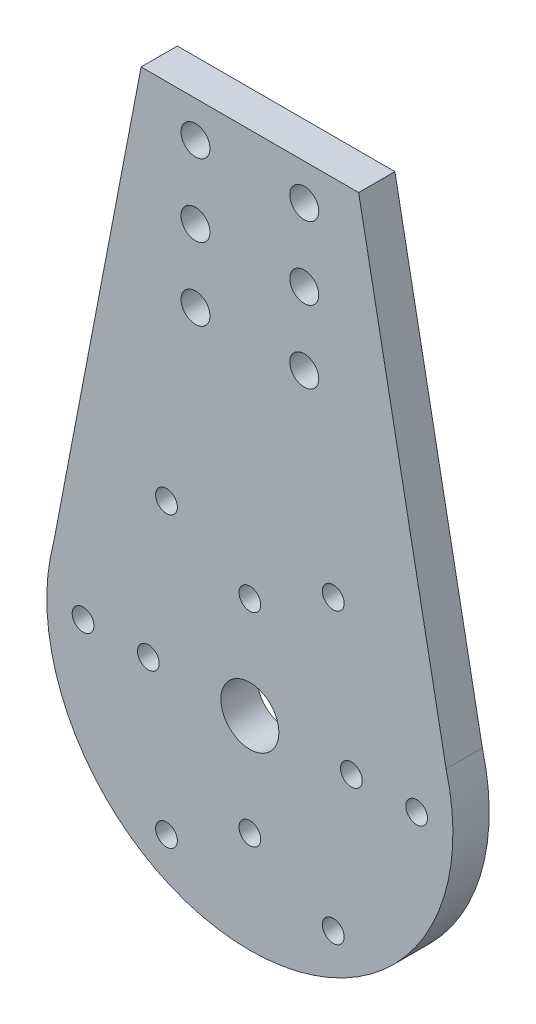
ISO-10303-21;
HEADER;
FILE_DESCRIPTION(('STEP AP214'),'2;1');
FILE_NAME('part.step','',(''),(''),'','','');
FILE_SCHEMA(('AUTOMOTIVE_DESIGN { 1 0 10303 214 1 1 1 1 }'));
ENDSEC;
DATA;
#1=APPLICATION_CONTEXT('core data for automotive mechanical design processes');
#2=APPLICATION_PROTOCOL_DEFINITION('international standard','automotive_design',2000,#1);
#3=PRODUCT_CONTEXT('',#1,'mechanical');
#4=PRODUCT('Part','Part','',(#3));
#5=PRODUCT_RELATED_PRODUCT_CATEGORY('part','',(#4));
#6=PRODUCT_DEFINITION_FORMATION('','',#4);
#7=PRODUCT_DEFINITION_CONTEXT('part definition',#1,'design');
#8=PRODUCT_DEFINITION('design','',#6,#7);
#9=PRODUCT_DEFINITION_SHAPE('','',#8);
#10=(LENGTH_UNIT() NAMED_UNIT(*) SI_UNIT(.MILLI.,.METRE.));
#11=(NAMED_UNIT(*) PLANE_ANGLE_UNIT() SI_UNIT($,.RADIAN.));
#12=(NAMED_UNIT(*) SI_UNIT($,.STERADIAN.) SOLID_ANGLE_UNIT());
#13=UNCERTAINTY_MEASURE_WITH_UNIT(LENGTH_MEASURE(1.E-05),#10,'distance_accuracy_value','');
#14=(GEOMETRIC_REPRESENTATION_CONTEXT(3) GLOBAL_UNCERTAINTY_ASSIGNED_CONTEXT((#13)) GLOBAL_UNIT_ASSIGNED_CONTEXT((#10,
#11,#12)) REPRESENTATION_CONTEXT('',''));
#15=CARTESIAN_POINT('',(0.,0.,0.));
#16=DIRECTION('',(0.,0.,1.));
#17=DIRECTION('',(1.,0.,0.));
#18=AXIS2_PLACEMENT_3D('',#15,#16,#17);
#19=CARTESIAN_POINT('',(0.,0.,5.));
#20=DIRECTION('',(0.,0.,-1.));
#21=DIRECTION('',(-1.,0.,0.));
#22=AXIS2_PLACEMENT_3D('',#19,#20,#21);
#23=CYLINDRICAL_SURFACE('',#22,28.);
#24=CARTESIAN_POINT('',(0.,0.,0.));
#25=DIRECTION('',(0.,0.,1.));
#26=DIRECTION('',(1.,0.,0.));
#27=AXIS2_PLACEMENT_3D('',#24,#25,#26);
#28=CIRCLE('',#27,28.);
#29=CARTESIAN_POINT('',(-27.0621638066991,7.1860482950914,0.));
#30=VERTEX_POINT('',#29);
#31=CARTESIAN_POINT('',(27.0621638066991,7.1860482950914,0.));
#32=VERTEX_POINT('',#31);
#33=EDGE_CURVE('E152',#30,#32,#28,.T.);
#34=ORIENTED_EDGE('',*,*,#33,.T.);
#35=DIRECTION('',(0.,0.,-1.));
#36=VECTOR('',#35,1.);
#37=CARTESIAN_POINT('',(27.0621638066991,7.1860482950914,5.));
#38=LINE('',#37,#36);
#39=CARTESIAN_POINT('',(27.0621638066991,7.1860482950914,5.));
#40=VERTEX_POINT('',#39);
#41=EDGE_CURVE('E11',#40,#32,#38,.T.);
#42=ORIENTED_EDGE('',*,*,#41,.F.);
#43=CARTESIAN_POINT('',(0.,0.,5.));
#44=DIRECTION('',(0.,0.,1.));
#45=DIRECTION('',(1.,0.,0.));
#46=AXIS2_PLACEMENT_3D('',#43,#44,#45);
#47=CIRCLE('',#46,28.);
#48=CARTESIAN_POINT('',(-27.0621638066991,7.1860482950914,5.));
#49=VERTEX_POINT('',#48);
#50=EDGE_CURVE('E77',#49,#40,#47,.T.);
#51=ORIENTED_EDGE('',*,*,#50,.F.);
#52=DIRECTION('',(0.,0.,-1.));
#53=VECTOR('',#52,1.);
#54=CARTESIAN_POINT('',(-27.0621638066991,7.1860482950914,5.));
#55=LINE('',#54,#53);
#56=EDGE_CURVE('E118',#49,#30,#55,.T.);
#57=ORIENTED_EDGE('',*,*,#56,.T.);
#58=EDGE_LOOP('',(#34,#42,#51,#57));
#59=FACE_BOUND('',#58,.T.);
#60=ADVANCED_FACE('F37',(#59),#23,.T.);
#61=CARTESIAN_POINT('',(27.4305835679166,5.26749525111794,5.));
#62=DIRECTION('',(0.982056983686742,0.188584412908647,0.));
#63=DIRECTION('',(-0.188584412908647,0.982056983686742,0.));
#64=AXIS2_PLACEMENT_3D('',#61,#62,#63);
#65=PLANE('',#64);
#66=DIRECTION('',(0.188584412908647,-0.982056983686742,0.));
#67=VECTOR('',#66,1.);
#68=CARTESIAN_POINT('',(27.4305835679166,5.26749525111794,0.));
#69=LINE('',#68,#67);
#70=CARTESIAN_POINT('',(15.,70.,0.));
#71=VERTEX_POINT('',#70);
#72=EDGE_CURVE('E86',#71,#32,#69,.T.);
#73=ORIENTED_EDGE('',*,*,#72,.F.);
#74=DIRECTION('',(0.,0.,-1.));
#75=VECTOR('',#74,1.);
#76=CARTESIAN_POINT('',(15.,70.,5.));
#77=LINE('',#76,#75);
#78=CARTESIAN_POINT('',(15.,70.,5.));
#79=VERTEX_POINT('',#78);
#80=EDGE_CURVE('E46',#79,#71,#77,.T.);
#81=ORIENTED_EDGE('',*,*,#80,.F.);
#82=DIRECTION('',(0.188584412908647,-0.982056983686742,0.));
#83=VECTOR('',#82,1.);
#84=CARTESIAN_POINT('',(27.4305835679166,5.26749525111794,5.));
#85=LINE('',#84,#83);
#86=EDGE_CURVE('E84',#79,#40,#85,.T.);
#87=ORIENTED_EDGE('',*,*,#86,.T.);
#88=ORIENTED_EDGE('',*,*,#41,.T.);
#89=EDGE_LOOP('',(#73,#81,#87,#88));
#90=FACE_BOUND('',#89,.T.);
#91=ADVANCED_FACE('F83',(#90),#65,.T.);
#92=CARTESIAN_POINT('',(0.,70.,5.));
#93=DIRECTION('',(0.,1.,0.));
#94=DIRECTION('',(0.,0.,1.));
#95=AXIS2_PLACEMENT_3D('',#92,#93,#94);
#96=PLANE('',#95);
#97=DIRECTION('',(1.,0.,0.));
#98=VECTOR('',#97,1.);
#99=CARTESIAN_POINT('',(0.,70.,0.));
#100=LINE('',#99,#98);
#101=CARTESIAN_POINT('',(-15.,70.,0.));
#102=VERTEX_POINT('',#101);
#103=EDGE_CURVE('E156',#102,#71,#100,.T.);
#104=ORIENTED_EDGE('',*,*,#103,.F.);
#105=DIRECTION('',(0.,0.,-1.));
#106=VECTOR('',#105,1.);
#107=CARTESIAN_POINT('',(-15.,70.,5.));
#108=LINE('',#107,#106);
#109=CARTESIAN_POINT('',(-15.,70.,5.));
#110=VERTEX_POINT('',#109);
#111=EDGE_CURVE('E69',#110,#102,#108,.T.);
#112=ORIENTED_EDGE('',*,*,#111,.F.);
#113=DIRECTION('',(1.,0.,0.));
#114=VECTOR('',#113,1.);
#115=CARTESIAN_POINT('',(0.,70.,5.));
#116=LINE('',#115,#114);
#117=EDGE_CURVE('E93',#110,#79,#116,.T.);
#118=ORIENTED_EDGE('',*,*,#117,.T.);
#119=ORIENTED_EDGE('',*,*,#80,.T.);
#120=EDGE_LOOP('',(#104,#112,#118,#119));
#121=FACE_BOUND('',#120,.T.);
#122=ADVANCED_FACE('F95',(#121),#96,.T.);
#123=CARTESIAN_POINT('',(7.5,55.,5.));
#124=DIRECTION('',(0.,0.,-1.));
#125=DIRECTION('',(-1.,0.,0.));
#126=AXIS2_PLACEMENT_3D('',#123,#124,#125);
#127=CYLINDRICAL_SURFACE('',#126,2.);
#128=CARTESIAN_POINT('',(7.5,55.,5.));
#129=DIRECTION('',(0.,0.,1.));
#130=DIRECTION('',(1.,0.,0.));
#131=AXIS2_PLACEMENT_3D('',#128,#129,#130);
#132=CIRCLE('',#131,2.);
#133=CARTESIAN_POINT('',(9.5,55.,5.));
#134=VERTEX_POINT('',#133);
#135=EDGE_CURVE('E112',#134,#134,#132,.T.);
#136=ORIENTED_EDGE('',*,*,#135,.T.);
#137=EDGE_LOOP('',(#136));
#138=FACE_BOUND('',#137,.T.);
#139=CARTESIAN_POINT('',(7.5,55.,0.));
#140=DIRECTION('',(0.,0.,1.));
#141=DIRECTION('',(1.,0.,0.));
#142=AXIS2_PLACEMENT_3D('',#139,#140,#141);
#143=CIRCLE('',#142,2.);
#144=CARTESIAN_POINT('',(9.5,55.,0.));
#145=VERTEX_POINT('',#144);
#146=EDGE_CURVE('E171',#145,#145,#143,.T.);
#147=ORIENTED_EDGE('',*,*,#146,.F.);
#148=EDGE_LOOP('',(#147));
#149=FACE_BOUND('',#148,.T.);
#150=ADVANCED_FACE('F470',(#138,#149),#127,.F.);
#151=CARTESIAN_POINT('',(-7.5,65.,5.));
#152=DIRECTION('',(0.,0.,-1.));
#153=DIRECTION('',(-1.,0.,0.));
#154=AXIS2_PLACEMENT_3D('',#151,#152,#153);
#155=CYLINDRICAL_SURFACE('',#154,2.);
#156=CARTESIAN_POINT('',(-7.5,65.,5.));
#157=DIRECTION('',(0.,0.,1.));
#158=DIRECTION('',(1.,0.,0.));
#159=AXIS2_PLACEMENT_3D('',#156,#157,#158);
#160=CIRCLE('',#159,2.);
#161=CARTESIAN_POINT('',(-5.5,65.,5.));
#162=VERTEX_POINT('',#161);
#163=EDGE_CURVE('E109',#162,#162,#160,.T.);
#164=ORIENTED_EDGE('',*,*,#163,.T.);
#165=EDGE_LOOP('',(#164));
#166=FACE_BOUND('',#165,.T.);
#167=CARTESIAN_POINT('',(-7.5,65.,0.));
#168=DIRECTION('',(0.,0.,1.));
#169=DIRECTION('',(1.,0.,0.));
#170=AXIS2_PLACEMENT_3D('',#167,#168,#169);
#171=CIRCLE('',#170,2.);
#172=CARTESIAN_POINT('',(-5.5,65.,0.));
#173=VERTEX_POINT('',#172);
#174=EDGE_CURVE('E168',#173,#173,#171,.T.);
#175=ORIENTED_EDGE('',*,*,#174,.F.);
#176=EDGE_LOOP('',(#175));
#177=FACE_BOUND('',#176,.T.);
#178=ADVANCED_FACE('F461',(#166,#177),#155,.F.);
#179=CARTESIAN_POINT('',(-7.5,55.,5.));
#180=DIRECTION('',(0.,0.,-1.));
#181=DIRECTION('',(-1.,0.,0.));
#182=AXIS2_PLACEMENT_3D('',#179,#180,#181);
#183=CYLINDRICAL_SURFACE('',#182,2.);
#184=CARTESIAN_POINT('',(-7.5,55.,5.));
#185=DIRECTION('',(0.,0.,1.));
#186=DIRECTION('',(1.,0.,0.));
#187=AXIS2_PLACEMENT_3D('',#184,#185,#186);
#188=CIRCLE('',#187,2.);
#189=CARTESIAN_POINT('',(-5.5,55.,5.));
#190=VERTEX_POINT('',#189);
#191=EDGE_CURVE('E106',#190,#190,#188,.T.);
#192=ORIENTED_EDGE('',*,*,#191,.T.);
#193=EDGE_LOOP('',(#192));
#194=FACE_BOUND('',#193,.T.);
#195=CARTESIAN_POINT('',(-7.5,55.,0.));
#196=DIRECTION('',(0.,0.,1.));
#197=DIRECTION('',(1.,0.,0.));
#198=AXIS2_PLACEMENT_3D('',#195,#196,#197);
#199=CIRCLE('',#198,2.);
#200=CARTESIAN_POINT('',(-5.5,55.,0.));
#201=VERTEX_POINT('',#200);
#202=EDGE_CURVE('E165',#201,#201,#199,.T.);
#203=ORIENTED_EDGE('',*,*,#202,.F.);
#204=EDGE_LOOP('',(#203));
#205=FACE_BOUND('',#204,.T.);
#206=ADVANCED_FACE('F452',(#194,#205),#183,.F.);
#207=CARTESIAN_POINT('',(-7.5,45.,5.));
#208=DIRECTION('',(0.,0.,-1.));
#209=DIRECTION('',(-1.,0.,0.));
#210=AXIS2_PLACEMENT_3D('',#207,#208,#209);
#211=CYLINDRICAL_SURFACE('',#210,2.);
#212=CARTESIAN_POINT('',(-7.5,45.,5.));
#213=DIRECTION('',(0.,0.,1.));
#214=DIRECTION('',(1.,0.,0.));
#215=AXIS2_PLACEMENT_3D('',#212,#213,#214);
#216=CIRCLE('',#215,2.);
#217=CARTESIAN_POINT('',(-5.5,45.,5.));
#218=VERTEX_POINT('',#217);
#219=EDGE_CURVE('E103',#218,#218,#216,.T.);
#220=ORIENTED_EDGE('',*,*,#219,.T.);
#221=EDGE_LOOP('',(#220));
#222=FACE_BOUND('',#221,.T.);
#223=CARTESIAN_POINT('',(-7.5,45.,0.));
#224=DIRECTION('',(0.,0.,1.));
#225=DIRECTION('',(1.,0.,0.));
#226=AXIS2_PLACEMENT_3D('',#223,#224,#225);
#227=CIRCLE('',#226,2.);
#228=CARTESIAN_POINT('',(-5.5,45.,0.));
#229=VERTEX_POINT('',#228);
#230=EDGE_CURVE('E162',#229,#229,#227,.T.);
#231=ORIENTED_EDGE('',*,*,#230,.F.);
#232=EDGE_LOOP('',(#231));
#233=FACE_BOUND('',#232,.T.);
#234=ADVANCED_FACE('F443',(#222,#233),#211,.F.);
#235=CARTESIAN_POINT('',(7.5,45.,5.));
#236=DIRECTION('',(0.,0.,-1.));
#237=DIRECTION('',(-1.,0.,0.));
#238=AXIS2_PLACEMENT_3D('',#235,#236,#237);
#239=CYLINDRICAL_SURFACE('',#238,2.);
#240=CARTESIAN_POINT('',(7.5,45.,5.));
#241=DIRECTION('',(0.,0.,1.));
#242=DIRECTION('',(1.,0.,0.));
#243=AXIS2_PLACEMENT_3D('',#240,#241,#242);
#244=CIRCLE('',#243,2.);
#245=CARTESIAN_POINT('',(9.5,45.,5.));
#246=VERTEX_POINT('',#245);
#247=EDGE_CURVE('E97',#246,#246,#244,.T.);
#248=ORIENTED_EDGE('',*,*,#247,.T.);
#249=EDGE_LOOP('',(#248));
#250=FACE_BOUND('',#249,.T.);
#251=CARTESIAN_POINT('',(7.5,45.,0.));
#252=DIRECTION('',(0.,0.,1.));
#253=DIRECTION('',(1.,0.,0.));
#254=AXIS2_PLACEMENT_3D('',#251,#252,#253);
#255=CIRCLE('',#254,2.);
#256=CARTESIAN_POINT('',(9.5,45.,0.));
#257=VERTEX_POINT('',#256);
#258=EDGE_CURVE('E159',#257,#257,#255,.T.);
#259=ORIENTED_EDGE('',*,*,#258,.F.);
#260=EDGE_LOOP('',(#259));
#261=FACE_BOUND('',#260,.T.);
#262=ADVANCED_FACE('F435',(#250,#261),#239,.F.);
#263=CARTESIAN_POINT('',(-27.4305835679166,5.26749525111794,5.));
#264=DIRECTION('',(0.982056983686742,-0.188584412908647,0.));
#265=DIRECTION('',(0.188584412908647,0.982056983686742,0.));
#266=AXIS2_PLACEMENT_3D('',#263,#264,#265);
#267=PLANE('',#266);
#268=DIRECTION('',(-0.188584412908647,-0.982056983686742,0.));
#269=VECTOR('',#268,1.);
#270=CARTESIAN_POINT('',(-27.4305835679166,5.26749525111794,0.));
#271=LINE('',#270,#269);
#272=EDGE_CURVE('E72',#102,#30,#271,.T.);
#273=ORIENTED_EDGE('',*,*,#272,.T.);
#274=ORIENTED_EDGE('',*,*,#56,.F.);
#275=DIRECTION('',(-0.188584412908647,-0.982056983686742,0.));
#276=VECTOR('',#275,1.);
#277=CARTESIAN_POINT('',(-27.4305835679166,5.26749525111794,5.));
#278=LINE('',#277,#276);
#279=EDGE_CURVE('E54',#110,#49,#278,.T.);
#280=ORIENTED_EDGE('',*,*,#279,.F.);
#281=ORIENTED_EDGE('',*,*,#111,.T.);
#282=EDGE_LOOP('',(#273,#274,#280,#281));
#283=FACE_BOUND('',#282,.T.);
#284=ADVANCED_FACE('F224',(#283),#267,.F.);
#285=CARTESIAN_POINT('',(23.,0.,5.));
#286=DIRECTION('',(0.,0.,-1.));
#287=DIRECTION('',(-1.,0.,0.));
#288=AXIS2_PLACEMENT_3D('',#285,#286,#287);
#289=CYLINDRICAL_SURFACE('',#288,1.5);
#290=CARTESIAN_POINT('',(23.,0.,5.));
#291=DIRECTION('',(0.,0.,1.));
#292=DIRECTION('',(1.,0.,0.));
#293=AXIS2_PLACEMENT_3D('',#290,#291,#292);
#294=CIRCLE('',#293,1.5);
#295=CARTESIAN_POINT('',(24.5,0.,5.));
#296=VERTEX_POINT('',#295);
#297=EDGE_CURVE('E322',#296,#296,#294,.T.);
#298=ORIENTED_EDGE('',*,*,#297,.T.);
#299=EDGE_LOOP('',(#298));
#300=FACE_BOUND('',#299,.T.);
#301=CARTESIAN_POINT('',(23.,0.,0.));
#302=DIRECTION('',(0.,0.,1.));
#303=DIRECTION('',(1.,0.,0.));
#304=AXIS2_PLACEMENT_3D('',#301,#302,#303);
#305=CIRCLE('',#304,1.5);
#306=CARTESIAN_POINT('',(24.5,0.,0.));
#307=VERTEX_POINT('',#306);
#308=EDGE_CURVE('E149',#307,#307,#305,.T.);
#309=ORIENTED_EDGE('',*,*,#308,.F.);
#310=EDGE_LOOP('',(#309));
#311=FACE_BOUND('',#310,.T.);
#312=ADVANCED_FACE('F220',(#300,#311),#289,.F.);
#313=CARTESIAN_POINT('',(11.5,19.9185842870421,5.));
#314=DIRECTION('',(0.,0.,-1.));
#315=DIRECTION('',(-1.,0.,0.));
#316=AXIS2_PLACEMENT_3D('',#313,#314,#315);
#317=CYLINDRICAL_SURFACE('',#316,1.5);
#318=CARTESIAN_POINT('',(11.5,19.9185842870421,5.));
#319=DIRECTION('',(0.,0.,1.));
#320=DIRECTION('',(1.,0.,0.));
#321=AXIS2_PLACEMENT_3D('',#318,#319,#320);
#322=CIRCLE('',#321,1.5);
#323=CARTESIAN_POINT('',(13.,19.9185842870421,5.));
#324=VERTEX_POINT('',#323);
#325=EDGE_CURVE('E319',#324,#324,#322,.T.);
#326=ORIENTED_EDGE('',*,*,#325,.T.);
#327=EDGE_LOOP('',(#326));
#328=FACE_BOUND('',#327,.T.);
#329=CARTESIAN_POINT('',(11.5,19.9185842870421,0.));
#330=DIRECTION('',(0.,0.,1.));
#331=DIRECTION('',(1.,0.,0.));
#332=AXIS2_PLACEMENT_3D('',#329,#330,#331);
#333=CIRCLE('',#332,1.5);
#334=CARTESIAN_POINT('',(13.,19.9185842870421,0.));
#335=VERTEX_POINT('',#334);
#336=EDGE_CURVE('E146',#335,#335,#333,.T.);
#337=ORIENTED_EDGE('',*,*,#336,.F.);
#338=EDGE_LOOP('',(#337));
#339=FACE_BOUND('',#338,.T.);
#340=ADVANCED_FACE('F223',(#328,#339),#317,.F.);
#341=CARTESIAN_POINT('',(-11.5000000000001,19.918584287042,5.));
#342=DIRECTION('',(0.,0.,-1.));
#343=DIRECTION('',(-1.,0.,0.));
#344=AXIS2_PLACEMENT_3D('',#341,#342,#343);
#345=CYLINDRICAL_SURFACE('',#344,1.5);
#346=CARTESIAN_POINT('',(-11.5000000000001,19.918584287042,5.));
#347=DIRECTION('',(0.,0.,1.));
#348=DIRECTION('',(1.,0.,0.));
#349=AXIS2_PLACEMENT_3D('',#346,#347,#348);
#350=CIRCLE('',#349,1.5);
#351=CARTESIAN_POINT('',(-10.0000000000001,19.918584287042,5.));
#352=VERTEX_POINT('',#351);
#353=EDGE_CURVE('E316',#352,#352,#350,.T.);
#354=ORIENTED_EDGE('',*,*,#353,.T.);
#355=EDGE_LOOP('',(#354));
#356=FACE_BOUND('',#355,.T.);
#357=CARTESIAN_POINT('',(-11.5000000000001,19.918584287042,0.));
#358=DIRECTION('',(0.,0.,1.));
#359=DIRECTION('',(1.,0.,0.));
#360=AXIS2_PLACEMENT_3D('',#357,#358,#359);
#361=CIRCLE('',#360,1.5);
#362=CARTESIAN_POINT('',(-10.0000000000001,19.918584287042,0.));
#363=VERTEX_POINT('',#362);
#364=EDGE_CURVE('E143',#363,#363,#361,.T.);
#365=ORIENTED_EDGE('',*,*,#364,.F.);
#366=EDGE_LOOP('',(#365));
#367=FACE_BOUND('',#366,.T.);
#368=ADVANCED_FACE('F228',(#356,#367),#345,.F.);
#369=CARTESIAN_POINT('',(-23.,0.,5.));
#370=DIRECTION('',(0.,0.,-1.));
#371=DIRECTION('',(-1.,0.,0.));
#372=AXIS2_PLACEMENT_3D('',#369,#370,#371);
#373=CYLINDRICAL_SURFACE('',#372,1.5);
#374=CARTESIAN_POINT('',(-23.,0.,5.));
#375=DIRECTION('',(0.,0.,1.));
#376=DIRECTION('',(1.,0.,0.));
#377=AXIS2_PLACEMENT_3D('',#374,#375,#376);
#378=CIRCLE('',#377,1.5);
#379=CARTESIAN_POINT('',(-21.5,0.,5.));
#380=VERTEX_POINT('',#379);
#381=EDGE_CURVE('E313',#380,#380,#378,.T.);
#382=ORIENTED_EDGE('',*,*,#381,.T.);
#383=EDGE_LOOP('',(#382));
#384=FACE_BOUND('',#383,.T.);
#385=CARTESIAN_POINT('',(-23.,0.,0.));
#386=DIRECTION('',(0.,0.,1.));
#387=DIRECTION('',(1.,0.,0.));
#388=AXIS2_PLACEMENT_3D('',#385,#386,#387);
#389=CIRCLE('',#388,1.5);
#390=CARTESIAN_POINT('',(-21.5,0.,0.));
#391=VERTEX_POINT('',#390);
#392=EDGE_CURVE('E140',#391,#391,#389,.T.);
#393=ORIENTED_EDGE('',*,*,#392,.F.);
#394=EDGE_LOOP('',(#393));
#395=FACE_BOUND('',#394,.T.);
#396=ADVANCED_FACE('F232',(#384,#395),#373,.F.);
#397=CARTESIAN_POINT('',(-11.4999999999999,-19.9185842870421,5.));
#398=DIRECTION('',(0.,0.,-1.));
#399=DIRECTION('',(-1.,0.,0.));
#400=AXIS2_PLACEMENT_3D('',#397,#398,#399);
#401=CYLINDRICAL_SURFACE('',#400,1.5);
#402=CARTESIAN_POINT('',(-11.4999999999999,-19.9185842870421,5.));
#403=DIRECTION('',(0.,0.,1.));
#404=DIRECTION('',(1.,0.,0.));
#405=AXIS2_PLACEMENT_3D('',#402,#403,#404);
#406=CIRCLE('',#405,1.5);
#407=CARTESIAN_POINT('',(-9.99999999999994,-19.9185842870421,5.));
#408=VERTEX_POINT('',#407);
#409=EDGE_CURVE('E310',#408,#408,#406,.T.);
#410=ORIENTED_EDGE('',*,*,#409,.T.);
#411=EDGE_LOOP('',(#410));
#412=FACE_BOUND('',#411,.T.);
#413=CARTESIAN_POINT('',(-11.4999999999999,-19.9185842870421,0.));
#414=DIRECTION('',(0.,0.,1.));
#415=DIRECTION('',(1.,0.,0.));
#416=AXIS2_PLACEMENT_3D('',#413,#414,#415);
#417=CIRCLE('',#416,1.5);
#418=CARTESIAN_POINT('',(-9.99999999999994,-19.9185842870421,0.));
#419=VERTEX_POINT('',#418);
#420=EDGE_CURVE('E137',#419,#419,#417,.T.);
#421=ORIENTED_EDGE('',*,*,#420,.F.);
#422=EDGE_LOOP('',(#421));
#423=FACE_BOUND('',#422,.T.);
#424=ADVANCED_FACE('F236',(#412,#423),#401,.F.);
#425=CARTESIAN_POINT('',(11.5000000000001,-19.918584287042,5.));
#426=DIRECTION('',(0.,0.,-1.));
#427=DIRECTION('',(-1.,0.,0.));
#428=AXIS2_PLACEMENT_3D('',#425,#426,#427);
#429=CYLINDRICAL_SURFACE('',#428,1.5);
#430=CARTESIAN_POINT('',(11.5000000000001,-19.918584287042,5.));
#431=DIRECTION('',(0.,0.,1.));
#432=DIRECTION('',(1.,0.,0.));
#433=AXIS2_PLACEMENT_3D('',#430,#431,#432);
#434=CIRCLE('',#433,1.5);
#435=CARTESIAN_POINT('',(13.0000000000001,-19.918584287042,5.));
#436=VERTEX_POINT('',#435);
#437=EDGE_CURVE('E307',#436,#436,#434,.T.);
#438=ORIENTED_EDGE('',*,*,#437,.T.);
#439=EDGE_LOOP('',(#438));
#440=FACE_BOUND('',#439,.T.);
#441=CARTESIAN_POINT('',(11.5000000000001,-19.918584287042,0.));
#442=DIRECTION('',(0.,0.,1.));
#443=DIRECTION('',(1.,0.,0.));
#444=AXIS2_PLACEMENT_3D('',#441,#442,#443);
#445=CIRCLE('',#444,1.5);
#446=CARTESIAN_POINT('',(13.0000000000001,-19.918584287042,0.));
#447=VERTEX_POINT('',#446);
#448=EDGE_CURVE('E134',#447,#447,#445,.T.);
#449=ORIENTED_EDGE('',*,*,#448,.F.);
#450=EDGE_LOOP('',(#449));
#451=FACE_BOUND('',#450,.T.);
#452=ADVANCED_FACE('F240',(#440,#451),#429,.F.);
#453=CARTESIAN_POINT('',(0.,0.,5.));
#454=DIRECTION('',(0.,0.,-1.));
#455=DIRECTION('',(-1.,0.,0.));
#456=AXIS2_PLACEMENT_3D('',#453,#454,#455);
#457=CYLINDRICAL_SURFACE('',#456,4.);
#458=CARTESIAN_POINT('',(0.,0.,5.));
#459=DIRECTION('',(0.,0.,1.));
#460=DIRECTION('',(1.,0.,0.));
#461=AXIS2_PLACEMENT_3D('',#458,#459,#460);
#462=CIRCLE('',#461,4.);
#463=CARTESIAN_POINT('',(4.,0.,5.));
#464=VERTEX_POINT('',#463);
#465=EDGE_CURVE('E304',#464,#464,#462,.T.);
#466=ORIENTED_EDGE('',*,*,#465,.T.);
#467=EDGE_LOOP('',(#466));
#468=FACE_BOUND('',#467,.T.);
#469=CARTESIAN_POINT('',(0.,0.,0.));
#470=DIRECTION('',(0.,0.,1.));
#471=DIRECTION('',(1.,0.,0.));
#472=AXIS2_PLACEMENT_3D('',#469,#470,#471);
#473=CIRCLE('',#472,4.);
#474=CARTESIAN_POINT('',(4.,0.,0.));
#475=VERTEX_POINT('',#474);
#476=EDGE_CURVE('E131',#475,#475,#473,.T.);
#477=ORIENTED_EDGE('',*,*,#476,.F.);
#478=EDGE_LOOP('',(#477));
#479=FACE_BOUND('',#478,.T.);
#480=ADVANCED_FACE('F244',(#468,#479),#457,.F.);
#481=CARTESIAN_POINT('',(0.,14.,5.));
#482=DIRECTION('',(0.,0.,-1.));
#483=DIRECTION('',(-1.,0.,0.));
#484=AXIS2_PLACEMENT_3D('',#481,#482,#483);
#485=CYLINDRICAL_SURFACE('',#484,1.5);
#486=CARTESIAN_POINT('',(0.,14.,5.));
#487=DIRECTION('',(0.,0.,1.));
#488=DIRECTION('',(1.,0.,0.));
#489=AXIS2_PLACEMENT_3D('',#486,#487,#488);
#490=CIRCLE('',#489,1.5);
#491=CARTESIAN_POINT('',(1.5,14.,5.));
#492=VERTEX_POINT('',#491);
#493=EDGE_CURVE('E297',#492,#492,#490,.T.);
#494=ORIENTED_EDGE('',*,*,#493,.T.);
#495=EDGE_LOOP('',(#494));
#496=FACE_BOUND('',#495,.T.);
#497=CARTESIAN_POINT('',(0.,14.,0.));
#498=DIRECTION('',(0.,0.,1.));
#499=DIRECTION('',(1.,0.,0.));
#500=AXIS2_PLACEMENT_3D('',#497,#498,#499);
#501=CIRCLE('',#500,1.5);
#502=CARTESIAN_POINT('',(1.5,14.,0.));
#503=VERTEX_POINT('',#502);
#504=EDGE_CURVE('E128',#503,#503,#501,.T.);
#505=ORIENTED_EDGE('',*,*,#504,.F.);
#506=EDGE_LOOP('',(#505));
#507=FACE_BOUND('',#506,.T.);
#508=ADVANCED_FACE('F248',(#496,#507),#485,.F.);
#509=CARTESIAN_POINT('',(14.,0.,5.));
#510=DIRECTION('',(0.,0.,-1.));
#511=DIRECTION('',(-1.,0.,0.));
#512=AXIS2_PLACEMENT_3D('',#509,#510,#511);
#513=CYLINDRICAL_SURFACE('',#512,1.5);
#514=CARTESIAN_POINT('',(14.,0.,5.));
#515=DIRECTION('',(0.,0.,1.));
#516=DIRECTION('',(1.,0.,0.));
#517=AXIS2_PLACEMENT_3D('',#514,#515,#516);
#518=CIRCLE('',#517,1.5);
#519=CARTESIAN_POINT('',(15.5,0.,5.));
#520=VERTEX_POINT('',#519);
#521=EDGE_CURVE('E294',#520,#520,#518,.T.);
#522=ORIENTED_EDGE('',*,*,#521,.T.);
#523=EDGE_LOOP('',(#522));
#524=FACE_BOUND('',#523,.T.);
#525=CARTESIAN_POINT('',(14.,0.,0.));
#526=DIRECTION('',(0.,0.,1.));
#527=DIRECTION('',(1.,0.,0.));
#528=AXIS2_PLACEMENT_3D('',#525,#526,#527);
#529=CIRCLE('',#528,1.5);
#530=CARTESIAN_POINT('',(15.5,0.,0.));
#531=VERTEX_POINT('',#530);
#532=EDGE_CURVE('E125',#531,#531,#529,.T.);
#533=ORIENTED_EDGE('',*,*,#532,.F.);
#534=EDGE_LOOP('',(#533));
#535=FACE_BOUND('',#534,.T.);
#536=ADVANCED_FACE('F252',(#524,#535),#513,.F.);
#537=CARTESIAN_POINT('',(0.,-14.,5.));
#538=DIRECTION('',(0.,0.,-1.));
#539=DIRECTION('',(-1.,0.,0.));
#540=AXIS2_PLACEMENT_3D('',#537,#538,#539);
#541=CYLINDRICAL_SURFACE('',#540,1.5);
#542=CARTESIAN_POINT('',(0.,-14.,5.));
#543=DIRECTION('',(0.,0.,1.));
#544=DIRECTION('',(1.,0.,0.));
#545=AXIS2_PLACEMENT_3D('',#542,#543,#544);
#546=CIRCLE('',#545,1.5);
#547=CARTESIAN_POINT('',(1.5,-14.,5.));
#548=VERTEX_POINT('',#547);
#549=EDGE_CURVE('E263',#548,#548,#546,.T.);
#550=ORIENTED_EDGE('',*,*,#549,.T.);
#551=EDGE_LOOP('',(#550));
#552=FACE_BOUND('',#551,.T.);
#553=CARTESIAN_POINT('',(0.,-14.,0.));
#554=DIRECTION('',(0.,0.,1.));
#555=DIRECTION('',(1.,0.,0.));
#556=AXIS2_PLACEMENT_3D('',#553,#554,#555);
#557=CIRCLE('',#556,1.5);
#558=CARTESIAN_POINT('',(1.5,-14.,0.));
#559=VERTEX_POINT('',#558);
#560=EDGE_CURVE('E122',#559,#559,#557,.T.);
#561=ORIENTED_EDGE('',*,*,#560,.F.);
#562=EDGE_LOOP('',(#561));
#563=FACE_BOUND('',#562,.T.);
#564=ADVANCED_FACE('F209',(#552,#563),#541,.F.);
#565=CARTESIAN_POINT('',(-14.,0.,5.));
#566=DIRECTION('',(0.,0.,-1.));
#567=DIRECTION('',(-1.,0.,0.));
#568=AXIS2_PLACEMENT_3D('',#565,#566,#567);
#569=CYLINDRICAL_SURFACE('',#568,1.5);
#570=CARTESIAN_POINT('',(-14.,0.,5.));
#571=DIRECTION('',(0.,0.,1.));
#572=DIRECTION('',(1.,0.,0.));
#573=AXIS2_PLACEMENT_3D('',#570,#571,#572);
#574=CIRCLE('',#573,1.5);
#575=CARTESIAN_POINT('',(-12.5,0.,5.));
#576=VERTEX_POINT('',#575);
#577=EDGE_CURVE('E177',#576,#576,#574,.T.);
#578=ORIENTED_EDGE('',*,*,#577,.T.);
#579=EDGE_LOOP('',(#578));
#580=FACE_BOUND('',#579,.T.);
#581=CARTESIAN_POINT('',(-14.,0.,0.));
#582=DIRECTION('',(0.,0.,1.));
#583=DIRECTION('',(1.,0.,0.));
#584=AXIS2_PLACEMENT_3D('',#581,#582,#583);
#585=CIRCLE('',#584,1.5);
#586=CARTESIAN_POINT('',(-12.5,0.,0.));
#587=VERTEX_POINT('',#586);
#588=EDGE_CURVE('E119',#587,#587,#585,.T.);
#589=ORIENTED_EDGE('',*,*,#588,.F.);
#590=EDGE_LOOP('',(#589));
#591=FACE_BOUND('',#590,.T.);
#592=ADVANCED_FACE('F39',(#580,#591),#569,.F.);
#593=CARTESIAN_POINT('',(7.5,65.,5.));
#594=DIRECTION('',(0.,0.,-1.));
#595=DIRECTION('',(-1.,0.,0.));
#596=AXIS2_PLACEMENT_3D('',#593,#594,#595);
#597=CYLINDRICAL_SURFACE('',#596,2.);
#598=CARTESIAN_POINT('',(7.5,65.,5.));
#599=DIRECTION('',(0.,0.,1.));
#600=DIRECTION('',(1.,0.,0.));
#601=AXIS2_PLACEMENT_3D('',#598,#599,#600);
#602=CIRCLE('',#601,2.);
#603=CARTESIAN_POINT('',(9.5,65.,5.));
#604=VERTEX_POINT('',#603);
#605=EDGE_CURVE('E115',#604,#604,#602,.T.);
#606=ORIENTED_EDGE('',*,*,#605,.T.);
#607=EDGE_LOOP('',(#606));
#608=FACE_BOUND('',#607,.T.);
#609=CARTESIAN_POINT('',(7.5,65.,0.));
#610=DIRECTION('',(0.,0.,1.));
#611=DIRECTION('',(1.,0.,0.));
#612=AXIS2_PLACEMENT_3D('',#609,#610,#611);
#613=CIRCLE('',#612,2.);
#614=CARTESIAN_POINT('',(9.5,65.,0.));
#615=VERTEX_POINT('',#614);
#616=EDGE_CURVE('E174',#615,#615,#613,.T.);
#617=ORIENTED_EDGE('',*,*,#616,.F.);
#618=EDGE_LOOP('',(#617));
#619=FACE_BOUND('',#618,.T.);
#620=ADVANCED_FACE('F199',(#608,#619),#597,.F.);
#621=CARTESIAN_POINT('',(0.,0.,5.));
#622=DIRECTION('',(0.,0.,1.));
#623=DIRECTION('',(1.,0.,0.));
#624=AXIS2_PLACEMENT_3D('',#621,#622,#623);
#625=PLANE('',#624);
#626=ORIENTED_EDGE('',*,*,#577,.F.);
#627=EDGE_LOOP('',(#626));
#628=FACE_BOUND('',#627,.T.);
#629=ORIENTED_EDGE('',*,*,#549,.F.);
#630=EDGE_LOOP('',(#629));
#631=FACE_BOUND('',#630,.T.);
#632=ORIENTED_EDGE('',*,*,#521,.F.);
#633=EDGE_LOOP('',(#632));
#634=FACE_BOUND('',#633,.T.);
#635=ORIENTED_EDGE('',*,*,#493,.F.);
#636=EDGE_LOOP('',(#635));
#637=FACE_BOUND('',#636,.T.);
#638=ORIENTED_EDGE('',*,*,#465,.F.);
#639=EDGE_LOOP('',(#638));
#640=FACE_BOUND('',#639,.T.);
#641=ORIENTED_EDGE('',*,*,#437,.F.);
#642=EDGE_LOOP('',(#641));
#643=FACE_BOUND('',#642,.T.);
#644=ORIENTED_EDGE('',*,*,#409,.F.);
#645=EDGE_LOOP('',(#644));
#646=FACE_BOUND('',#645,.T.);
#647=ORIENTED_EDGE('',*,*,#381,.F.);
#648=EDGE_LOOP('',(#647));
#649=FACE_BOUND('',#648,.T.);
#650=ORIENTED_EDGE('',*,*,#353,.F.);
#651=EDGE_LOOP('',(#650));
#652=FACE_BOUND('',#651,.T.);
#653=ORIENTED_EDGE('',*,*,#325,.F.);
#654=EDGE_LOOP('',(#653));
#655=FACE_BOUND('',#654,.T.);
#656=ORIENTED_EDGE('',*,*,#297,.F.);
#657=EDGE_LOOP('',(#656));
#658=FACE_BOUND('',#657,.T.);
#659=ORIENTED_EDGE('',*,*,#50,.T.);
#660=ORIENTED_EDGE('',*,*,#86,.F.);
#661=ORIENTED_EDGE('',*,*,#117,.F.);
#662=ORIENTED_EDGE('',*,*,#279,.T.);
#663=EDGE_LOOP('',(#659,#660,#661,#662));
#664=FACE_BOUND('',#663,.T.);
#665=ORIENTED_EDGE('',*,*,#247,.F.);
#666=EDGE_LOOP('',(#665));
#667=FACE_BOUND('',#666,.T.);
#668=ORIENTED_EDGE('',*,*,#219,.F.);
#669=EDGE_LOOP('',(#668));
#670=FACE_BOUND('',#669,.T.);
#671=ORIENTED_EDGE('',*,*,#191,.F.);
#672=EDGE_LOOP('',(#671));
#673=FACE_BOUND('',#672,.T.);
#674=ORIENTED_EDGE('',*,*,#163,.F.);
#675=EDGE_LOOP('',(#674));
#676=FACE_BOUND('',#675,.T.);
#677=ORIENTED_EDGE('',*,*,#135,.F.);
#678=EDGE_LOOP('',(#677));
#679=FACE_BOUND('',#678,.T.);
#680=ORIENTED_EDGE('',*,*,#605,.F.);
#681=EDGE_LOOP('',(#680));
#682=FACE_BOUND('',#681,.T.);
#683=ADVANCED_FACE('F91',(#628,#631,#634,#637,#640,#643,#646,#649,#652,#655,#658,#664,#667,#670,
#673,#676,#679,#682),#625,.T.);
#684=CARTESIAN_POINT('',(0.,0.,0.));
#685=DIRECTION('',(0.,0.,1.));
#686=DIRECTION('',(1.,0.,0.));
#687=AXIS2_PLACEMENT_3D('',#684,#685,#686);
#688=PLANE('',#687);
#689=ORIENTED_EDGE('',*,*,#588,.T.);
#690=EDGE_LOOP('',(#689));
#691=FACE_BOUND('',#690,.T.);
#692=ORIENTED_EDGE('',*,*,#560,.T.);
#693=EDGE_LOOP('',(#692));
#694=FACE_BOUND('',#693,.T.);
#695=ORIENTED_EDGE('',*,*,#532,.T.);
#696=EDGE_LOOP('',(#695));
#697=FACE_BOUND('',#696,.T.);
#698=ORIENTED_EDGE('',*,*,#504,.T.);
#699=EDGE_LOOP('',(#698));
#700=FACE_BOUND('',#699,.T.);
#701=ORIENTED_EDGE('',*,*,#476,.T.);
#702=EDGE_LOOP('',(#701));
#703=FACE_BOUND('',#702,.T.);
#704=ORIENTED_EDGE('',*,*,#448,.T.);
#705=EDGE_LOOP('',(#704));
#706=FACE_BOUND('',#705,.T.);
#707=ORIENTED_EDGE('',*,*,#420,.T.);
#708=EDGE_LOOP('',(#707));
#709=FACE_BOUND('',#708,.T.);
#710=ORIENTED_EDGE('',*,*,#392,.T.);
#711=EDGE_LOOP('',(#710));
#712=FACE_BOUND('',#711,.T.);
#713=ORIENTED_EDGE('',*,*,#364,.T.);
#714=EDGE_LOOP('',(#713));
#715=FACE_BOUND('',#714,.T.);
#716=ORIENTED_EDGE('',*,*,#336,.T.);
#717=EDGE_LOOP('',(#716));
#718=FACE_BOUND('',#717,.T.);
#719=ORIENTED_EDGE('',*,*,#308,.T.);
#720=EDGE_LOOP('',(#719));
#721=FACE_BOUND('',#720,.T.);
#722=ORIENTED_EDGE('',*,*,#33,.F.);
#723=ORIENTED_EDGE('',*,*,#272,.F.);
#724=ORIENTED_EDGE('',*,*,#103,.T.);
#725=ORIENTED_EDGE('',*,*,#72,.T.);
#726=EDGE_LOOP('',(#722,#723,#724,#725));
#727=FACE_BOUND('',#726,.T.);
#728=ORIENTED_EDGE('',*,*,#258,.T.);
#729=EDGE_LOOP('',(#728));
#730=FACE_BOUND('',#729,.T.);
#731=ORIENTED_EDGE('',*,*,#230,.T.);
#732=EDGE_LOOP('',(#731));
#733=FACE_BOUND('',#732,.T.);
#734=ORIENTED_EDGE('',*,*,#202,.T.);
#735=EDGE_LOOP('',(#734));
#736=FACE_BOUND('',#735,.T.);
#737=ORIENTED_EDGE('',*,*,#174,.T.);
#738=EDGE_LOOP('',(#737));
#739=FACE_BOUND('',#738,.T.);
#740=ORIENTED_EDGE('',*,*,#146,.T.);
#741=EDGE_LOOP('',(#740));
#742=FACE_BOUND('',#741,.T.);
#743=ORIENTED_EDGE('',*,*,#616,.T.);
#744=EDGE_LOOP('',(#743));
#745=FACE_BOUND('',#744,.T.);
#746=ADVANCED_FACE('F182',(#691,#694,#697,#700,#703,#706,#709,#712,#715,#718,#721,#727,#730,
#733,#736,#739,#742,#745),#688,.F.);
#747=CLOSED_SHELL('',(#60,#91,#122,#150,#178,#206,#234,#262,#284,#312,#340,#368,#396,#424,#452,
#480,#508,#536,#564,#592,#620,#683,#746));
#748=MANIFOLD_SOLID_BREP('B2',#747);
#749=ADVANCED_BREP_SHAPE_REPRESENTATION('',(#18,#748),#14);
#750=SHAPE_DEFINITION_REPRESENTATION(#9,#749);
ENDSEC;
END-ISO-10303-21;
